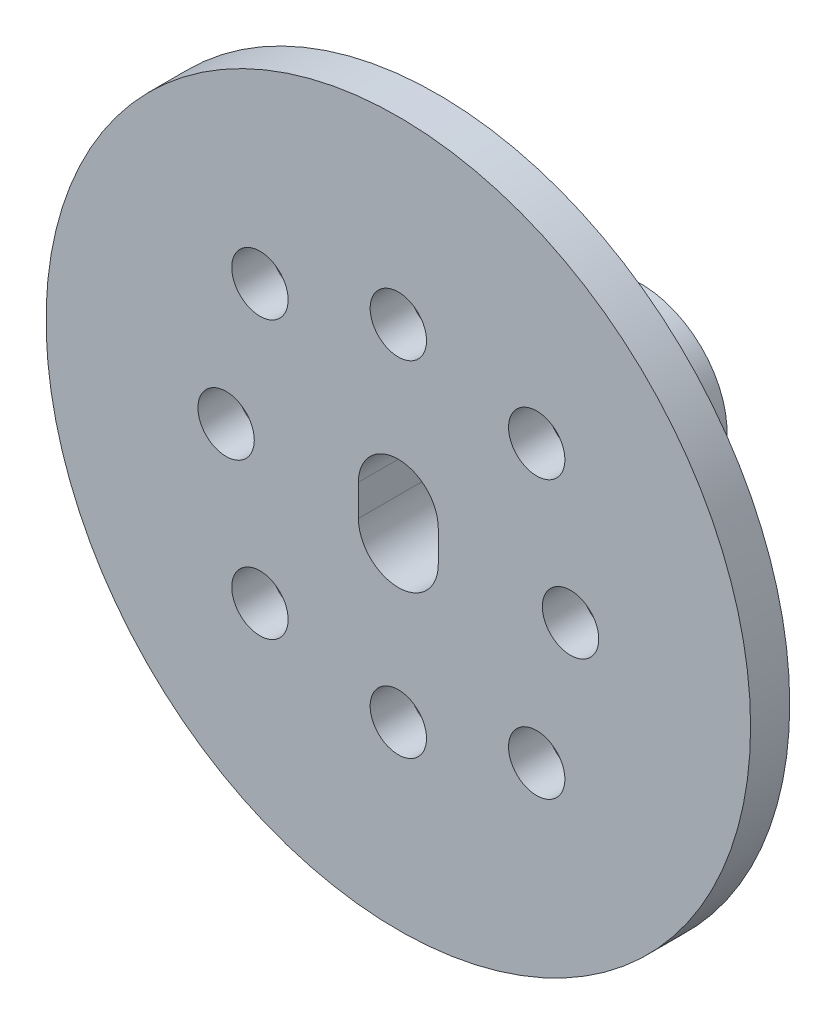
ISO-10303-21;
HEADER;
FILE_DESCRIPTION(('STEP AP214'),'2;1');
FILE_NAME('part.step','',(''),(''),'','','');
FILE_SCHEMA(('AUTOMOTIVE_DESIGN { 1 0 10303 214 1 1 1 1 }'));
ENDSEC;
DATA;
#1=APPLICATION_CONTEXT('core data for automotive mechanical design processes');
#2=APPLICATION_PROTOCOL_DEFINITION('international standard','automotive_design',2000,#1);
#3=PRODUCT_CONTEXT('',#1,'mechanical');
#4=PRODUCT('Part','Part','',(#3));
#5=PRODUCT_RELATED_PRODUCT_CATEGORY('part','',(#4));
#6=PRODUCT_DEFINITION_FORMATION('','',#4);
#7=PRODUCT_DEFINITION_CONTEXT('part definition',#1,'design');
#8=PRODUCT_DEFINITION('design','',#6,#7);
#9=PRODUCT_DEFINITION_SHAPE('','',#8);
#10=(LENGTH_UNIT() NAMED_UNIT(*) SI_UNIT(.MILLI.,.METRE.));
#11=(NAMED_UNIT(*) PLANE_ANGLE_UNIT() SI_UNIT($,.RADIAN.));
#12=(NAMED_UNIT(*) SI_UNIT($,.STERADIAN.) SOLID_ANGLE_UNIT());
#13=UNCERTAINTY_MEASURE_WITH_UNIT(LENGTH_MEASURE(1.E-05),#10,'distance_accuracy_value','');
#14=(GEOMETRIC_REPRESENTATION_CONTEXT(3) GLOBAL_UNCERTAINTY_ASSIGNED_CONTEXT((#13)) GLOBAL_UNIT_ASSIGNED_CONTEXT((#10,
#11,#12)) REPRESENTATION_CONTEXT('',''));
#15=CARTESIAN_POINT('',(0.,0.,0.));
#16=DIRECTION('',(0.,0.,1.));
#17=DIRECTION('',(1.,0.,0.));
#18=AXIS2_PLACEMENT_3D('',#15,#16,#17);
#19=CARTESIAN_POINT('',(0.,0.,-13.));
#20=DIRECTION('',(0.,0.,-1.));
#21=DIRECTION('',(-1.,0.,0.));
#22=AXIS2_PLACEMENT_3D('',#19,#20,#21);
#23=PLANE('',#22);
#24=CARTESIAN_POINT('',(0.000237242195675481,1.0001390942149,-13.));
#25=DIRECTION('',(0.,0.,-1.));
#26=DIRECTION('',(-1.,0.,0.));
#27=AXIS2_PLACEMENT_3D('',#24,#25,#26);
#28=CIRCLE('',#27,3.05);
#29=CARTESIAN_POINT('',(3.05023724219568,1.0001390942149,-13.));
#30=VERTEX_POINT('',#29);
#31=CARTESIAN_POINT('',(-3.04976275780432,1.0001390942149,-13.));
#32=VERTEX_POINT('',#31);
#33=EDGE_CURVE('E187',#30,#32,#28,.F.);
#34=ORIENTED_EDGE('',*,*,#33,.T.);
#35=DIRECTION('',(0.,1.,0.));
#36=VECTOR('',#35,1.);
#37=CARTESIAN_POINT('',(-3.04976275780432,0.,-13.));
#38=LINE('',#37,#36);
#39=CARTESIAN_POINT('',(-3.04976275780432,-0.999860905785103,-13.));
#40=VERTEX_POINT('',#39);
#41=EDGE_CURVE('E191',#32,#40,#38,.F.);
#42=ORIENTED_EDGE('',*,*,#41,.T.);
#43=CARTESIAN_POINT('',(0.000237242195675477,-0.999860905785103,-13.));
#44=DIRECTION('',(0.,0.,-1.));
#45=DIRECTION('',(-1.,0.,0.));
#46=AXIS2_PLACEMENT_3D('',#43,#44,#45);
#47=CIRCLE('',#46,3.05);
#48=CARTESIAN_POINT('',(3.05023724219568,-0.999860905785103,-13.));
#49=VERTEX_POINT('',#48);
#50=EDGE_CURVE('E188',#40,#49,#47,.F.);
#51=ORIENTED_EDGE('',*,*,#50,.T.);
#52=DIRECTION('',(0.,1.,0.));
#53=VECTOR('',#52,1.);
#54=CARTESIAN_POINT('',(3.05023724219568,1.0001390942149,-13.));
#55=LINE('',#54,#53);
#56=EDGE_CURVE('E189',#49,#30,#55,.T.);
#57=ORIENTED_EDGE('',*,*,#56,.T.);
#58=EDGE_LOOP('',(#34,#42,#51,#57));
#59=FACE_BOUND('',#58,.T.);
#60=CARTESIAN_POINT('',(0.,0.,-13.));
#61=DIRECTION('',(0.,0.,-1.));
#62=DIRECTION('',(-1.,0.,0.));
#63=AXIS2_PLACEMENT_3D('',#60,#61,#62);
#64=CIRCLE('',#63,5.5);
#65=CARTESIAN_POINT('',(-5.5,0.,-13.));
#66=VERTEX_POINT('',#65);
#67=EDGE_CURVE('E117',#66,#66,#64,.T.);
#68=ORIENTED_EDGE('',*,*,#67,.T.);
#69=EDGE_LOOP('',(#68));
#70=FACE_BOUND('',#69,.T.);
#71=ADVANCED_FACE('F43',(#59,#70),#23,.T.);
#72=CARTESIAN_POINT('',(0.,0.,2.5));
#73=DIRECTION('',(0.,0.,-1.));
#74=DIRECTION('',(-1.,0.,0.));
#75=AXIS2_PLACEMENT_3D('',#72,#73,#74);
#76=CYLINDRICAL_SURFACE('',#75,22.5);
#77=CARTESIAN_POINT('',(0.,0.,2.5));
#78=DIRECTION('',(0.,0.,1.));
#79=DIRECTION('',(1.,0.,0.));
#80=AXIS2_PLACEMENT_3D('',#77,#78,#79);
#81=CIRCLE('',#80,22.5);
#82=CARTESIAN_POINT('',(22.5,0.,2.5));
#83=VERTEX_POINT('',#82);
#84=EDGE_CURVE('E156',#83,#83,#81,.T.);
#85=ORIENTED_EDGE('',*,*,#84,.F.);
#86=EDGE_LOOP('',(#85));
#87=FACE_BOUND('',#86,.T.);
#88=CARTESIAN_POINT('',(0.,0.,0.));
#89=DIRECTION('',(0.,0.,1.));
#90=DIRECTION('',(1.,0.,0.));
#91=AXIS2_PLACEMENT_3D('',#88,#89,#90);
#92=CIRCLE('',#91,22.5);
#93=CARTESIAN_POINT('',(22.5,0.,0.));
#94=VERTEX_POINT('',#93);
#95=EDGE_CURVE('E154',#94,#94,#92,.T.);
#96=ORIENTED_EDGE('',*,*,#95,.T.);
#97=EDGE_LOOP('',(#96));
#98=FACE_BOUND('',#97,.T.);
#99=ADVANCED_FACE('F239',(#87,#98),#76,.T.);
#100=CARTESIAN_POINT('',(0.,0.,2.5));
#101=DIRECTION('',(0.,0.,1.));
#102=DIRECTION('',(1.,0.,0.));
#103=AXIS2_PLACEMENT_3D('',#100,#101,#102);
#104=PLANE('',#103);
#105=CARTESIAN_POINT('',(0.000237242195675481,1.0001390942149,2.5));
#106=DIRECTION('',(0.,0.,-1.));
#107=DIRECTION('',(-1.,0.,0.));
#108=AXIS2_PLACEMENT_3D('',#105,#106,#107);
#109=CIRCLE('',#108,2.55);
#110=CARTESIAN_POINT('',(-2.54976275780432,1.0001390942149,2.5));
#111=VERTEX_POINT('',#110);
#112=CARTESIAN_POINT('',(2.55023724219568,1.0001390942149,2.5));
#113=VERTEX_POINT('',#112);
#114=EDGE_CURVE('E100',#111,#113,#109,.T.);
#115=ORIENTED_EDGE('',*,*,#114,.T.);
#116=DIRECTION('',(0.,-1.,0.));
#117=VECTOR('',#116,1.);
#118=CARTESIAN_POINT('',(2.55023724219568,1.0001390942149,2.5));
#119=LINE('',#118,#117);
#120=CARTESIAN_POINT('',(2.55023724219568,-0.999860905785103,2.5));
#121=VERTEX_POINT('',#120);
#122=EDGE_CURVE('E102',#113,#121,#119,.T.);
#123=ORIENTED_EDGE('',*,*,#122,.T.);
#124=CARTESIAN_POINT('',(0.000237242195675477,-0.999860905785103,2.5));
#125=DIRECTION('',(0.,0.,-1.));
#126=DIRECTION('',(-1.,0.,0.));
#127=AXIS2_PLACEMENT_3D('',#124,#125,#126);
#128=CIRCLE('',#127,2.55);
#129=CARTESIAN_POINT('',(-2.54976275780432,-0.999860905785103,2.5));
#130=VERTEX_POINT('',#129);
#131=EDGE_CURVE('E107',#121,#130,#128,.T.);
#132=ORIENTED_EDGE('',*,*,#131,.T.);
#133=DIRECTION('',(0.,1.,0.));
#134=VECTOR('',#133,1.);
#135=CARTESIAN_POINT('',(-2.54976275780432,-0.999860905785103,2.5));
#136=LINE('',#135,#134);
#137=EDGE_CURVE('E112',#130,#111,#136,.T.);
#138=ORIENTED_EDGE('',*,*,#137,.T.);
#139=EDGE_LOOP('',(#115,#123,#132,#138));
#140=FACE_BOUND('',#139,.T.);
#141=CARTESIAN_POINT('',(-8.83883476483183,8.83883476483186,2.5));
#142=DIRECTION('',(0.,0.,1.));
#143=DIRECTION('',(1.,0.,0.));
#144=AXIS2_PLACEMENT_3D('',#141,#142,#143);
#145=CIRCLE('',#144,1.8);
#146=CARTESIAN_POINT('',(-7.03883476483183,8.83883476483186,2.5));
#147=VERTEX_POINT('',#146);
#148=EDGE_CURVE('E134',#147,#147,#145,.T.);
#149=ORIENTED_EDGE('',*,*,#148,.F.);
#150=EDGE_LOOP('',(#149));
#151=FACE_BOUND('',#150,.T.);
#152=CARTESIAN_POINT('',(8.83883476483189,8.8388347648318,2.5));
#153=DIRECTION('',(0.,0.,1.));
#154=DIRECTION('',(1.,0.,0.));
#155=AXIS2_PLACEMENT_3D('',#152,#153,#154);
#156=CIRCLE('',#155,1.8);
#157=CARTESIAN_POINT('',(10.6388347648319,8.8388347648318,2.5));
#158=VERTEX_POINT('',#157);
#159=EDGE_CURVE('E138',#158,#158,#156,.T.);
#160=ORIENTED_EDGE('',*,*,#159,.F.);
#161=EDGE_LOOP('',(#160));
#162=FACE_BOUND('',#161,.T.);
#163=CARTESIAN_POINT('',(8.83883476483177,-8.83883476483192,2.5));
#164=DIRECTION('',(0.,0.,1.));
#165=DIRECTION('',(1.,0.,0.));
#166=AXIS2_PLACEMENT_3D('',#163,#164,#165);
#167=CIRCLE('',#166,1.8);
#168=CARTESIAN_POINT('',(10.6388347648318,-8.83883476483192,2.5));
#169=VERTEX_POINT('',#168);
#170=EDGE_CURVE('E145',#169,#169,#167,.T.);
#171=ORIENTED_EDGE('',*,*,#170,.F.);
#172=EDGE_LOOP('',(#171));
#173=FACE_BOUND('',#172,.T.);
#174=CARTESIAN_POINT('',(-8.83883476483195,-8.83883476483174,2.5));
#175=DIRECTION('',(0.,0.,1.));
#176=DIRECTION('',(1.,0.,0.));
#177=AXIS2_PLACEMENT_3D('',#174,#175,#176);
#178=CIRCLE('',#177,1.8);
#179=CARTESIAN_POINT('',(-7.03883476483195,-8.83883476483174,2.5));
#180=VERTEX_POINT('',#179);
#181=EDGE_CURVE('E130',#180,#180,#178,.T.);
#182=ORIENTED_EDGE('',*,*,#181,.F.);
#183=EDGE_LOOP('',(#182));
#184=FACE_BOUND('',#183,.T.);
#185=CARTESIAN_POINT('',(11.,0.,2.5));
#186=DIRECTION('',(0.,0.,1.));
#187=DIRECTION('',(1.,0.,0.));
#188=AXIS2_PLACEMENT_3D('',#185,#186,#187);
#189=CIRCLE('',#188,1.8);
#190=CARTESIAN_POINT('',(12.8,0.,2.5));
#191=VERTEX_POINT('',#190);
#192=EDGE_CURVE('E123',#191,#191,#189,.T.);
#193=ORIENTED_EDGE('',*,*,#192,.F.);
#194=EDGE_LOOP('',(#193));
#195=FACE_BOUND('',#194,.T.);
#196=CARTESIAN_POINT('',(0.,-11.,2.5));
#197=DIRECTION('',(0.,0.,1.));
#198=DIRECTION('',(1.,0.,0.));
#199=AXIS2_PLACEMENT_3D('',#196,#197,#198);
#200=CIRCLE('',#199,1.8);
#201=CARTESIAN_POINT('',(1.79999999999992,-11.,2.5));
#202=VERTEX_POINT('',#201);
#203=EDGE_CURVE('E128',#202,#202,#200,.T.);
#204=ORIENTED_EDGE('',*,*,#203,.F.);
#205=EDGE_LOOP('',(#204));
#206=FACE_BOUND('',#205,.T.);
#207=CARTESIAN_POINT('',(-11.,1.15218884181823E-13,2.5));
#208=DIRECTION('',(0.,0.,1.));
#209=DIRECTION('',(1.,0.,0.));
#210=AXIS2_PLACEMENT_3D('',#207,#208,#209);
#211=CIRCLE('',#210,1.8);
#212=CARTESIAN_POINT('',(-9.2,1.15218884181823E-13,2.5));
#213=VERTEX_POINT('',#212);
#214=EDGE_CURVE('E135',#213,#213,#211,.T.);
#215=ORIENTED_EDGE('',*,*,#214,.F.);
#216=EDGE_LOOP('',(#215));
#217=FACE_BOUND('',#216,.T.);
#218=CARTESIAN_POINT('',(0.,11.,2.5));
#219=DIRECTION('',(0.,0.,1.));
#220=DIRECTION('',(1.,0.,0.));
#221=AXIS2_PLACEMENT_3D('',#218,#219,#220);
#222=CIRCLE('',#221,1.8);
#223=CARTESIAN_POINT('',(1.8,11.,2.5));
#224=VERTEX_POINT('',#223);
#225=EDGE_CURVE('E139',#224,#224,#222,.T.);
#226=ORIENTED_EDGE('',*,*,#225,.F.);
#227=EDGE_LOOP('',(#226));
#228=FACE_BOUND('',#227,.T.);
#229=ORIENTED_EDGE('',*,*,#84,.T.);
#230=EDGE_LOOP('',(#229));
#231=FACE_BOUND('',#230,.T.);
#232=ADVANCED_FACE('F111',(#140,#151,#162,#173,#184,#195,#206,#217,#228,#231),#104,.T.);
#233=CARTESIAN_POINT('',(0.,0.,0.));
#234=DIRECTION('',(0.,0.,1.));
#235=DIRECTION('',(1.,0.,0.));
#236=AXIS2_PLACEMENT_3D('',#233,#234,#235);
#237=PLANE('',#236);
#238=CARTESIAN_POINT('',(-8.83883476483183,8.83883476483186,0.));
#239=DIRECTION('',(0.,0.,1.));
#240=DIRECTION('',(1.,0.,0.));
#241=AXIS2_PLACEMENT_3D('',#238,#239,#240);
#242=CIRCLE('',#241,1.8);
#243=CARTESIAN_POINT('',(-7.03883476483183,8.83883476483186,0.));
#244=VERTEX_POINT('',#243);
#245=EDGE_CURVE('E155',#244,#244,#242,.T.);
#246=ORIENTED_EDGE('',*,*,#245,.T.);
#247=EDGE_LOOP('',(#246));
#248=FACE_BOUND('',#247,.T.);
#249=CARTESIAN_POINT('',(8.83883476483189,8.8388347648318,0.));
#250=DIRECTION('',(0.,0.,1.));
#251=DIRECTION('',(1.,0.,0.));
#252=AXIS2_PLACEMENT_3D('',#249,#250,#251);
#253=CIRCLE('',#252,1.8);
#254=CARTESIAN_POINT('',(10.6388347648319,8.8388347648318,0.));
#255=VERTEX_POINT('',#254);
#256=EDGE_CURVE('E177',#255,#255,#253,.T.);
#257=ORIENTED_EDGE('',*,*,#256,.T.);
#258=EDGE_LOOP('',(#257));
#259=FACE_BOUND('',#258,.T.);
#260=CARTESIAN_POINT('',(8.83883476483177,-8.83883476483192,0.));
#261=DIRECTION('',(0.,0.,1.));
#262=DIRECTION('',(1.,0.,0.));
#263=AXIS2_PLACEMENT_3D('',#260,#261,#262);
#264=CIRCLE('',#263,1.8);
#265=CARTESIAN_POINT('',(10.6388347648318,-8.83883476483192,0.));
#266=VERTEX_POINT('',#265);
#267=EDGE_CURVE('E176',#266,#266,#264,.T.);
#268=ORIENTED_EDGE('',*,*,#267,.T.);
#269=EDGE_LOOP('',(#268));
#270=FACE_BOUND('',#269,.T.);
#271=CARTESIAN_POINT('',(-8.83883476483195,-8.83883476483174,0.));
#272=DIRECTION('',(0.,0.,1.));
#273=DIRECTION('',(1.,0.,0.));
#274=AXIS2_PLACEMENT_3D('',#271,#272,#273);
#275=CIRCLE('',#274,1.8);
#276=CARTESIAN_POINT('',(-7.03883476483195,-8.83883476483174,0.));
#277=VERTEX_POINT('',#276);
#278=EDGE_CURVE('E173',#277,#277,#275,.T.);
#279=ORIENTED_EDGE('',*,*,#278,.T.);
#280=EDGE_LOOP('',(#279));
#281=FACE_BOUND('',#280,.T.);
#282=CARTESIAN_POINT('',(11.,0.,0.));
#283=DIRECTION('',(0.,0.,1.));
#284=DIRECTION('',(1.,0.,0.));
#285=AXIS2_PLACEMENT_3D('',#282,#283,#284);
#286=CIRCLE('',#285,1.8);
#287=CARTESIAN_POINT('',(12.8,0.,0.));
#288=VERTEX_POINT('',#287);
#289=EDGE_CURVE('E167',#288,#288,#286,.T.);
#290=ORIENTED_EDGE('',*,*,#289,.T.);
#291=EDGE_LOOP('',(#290));
#292=FACE_BOUND('',#291,.T.);
#293=CARTESIAN_POINT('',(0.,-11.,0.));
#294=DIRECTION('',(0.,0.,1.));
#295=DIRECTION('',(1.,0.,0.));
#296=AXIS2_PLACEMENT_3D('',#293,#294,#295);
#297=CIRCLE('',#296,1.8);
#298=CARTESIAN_POINT('',(1.79999999999992,-11.,0.));
#299=VERTEX_POINT('',#298);
#300=EDGE_CURVE('E170',#299,#299,#297,.T.);
#301=ORIENTED_EDGE('',*,*,#300,.T.);
#302=EDGE_LOOP('',(#301));
#303=FACE_BOUND('',#302,.T.);
#304=CARTESIAN_POINT('',(-11.,1.15218884181823E-13,0.));
#305=DIRECTION('',(0.,0.,1.));
#306=DIRECTION('',(1.,0.,0.));
#307=AXIS2_PLACEMENT_3D('',#304,#305,#306);
#308=CIRCLE('',#307,1.8);
#309=CARTESIAN_POINT('',(-9.2,1.15218884181823E-13,0.));
#310=VERTEX_POINT('',#309);
#311=EDGE_CURVE('E165',#310,#310,#308,.T.);
#312=ORIENTED_EDGE('',*,*,#311,.T.);
#313=EDGE_LOOP('',(#312));
#314=FACE_BOUND('',#313,.T.);
#315=CARTESIAN_POINT('',(0.,11.,0.));
#316=DIRECTION('',(0.,0.,1.));
#317=DIRECTION('',(1.,0.,0.));
#318=AXIS2_PLACEMENT_3D('',#315,#316,#317);
#319=CIRCLE('',#318,1.8);
#320=CARTESIAN_POINT('',(1.8,11.,0.));
#321=VERTEX_POINT('',#320);
#322=EDGE_CURVE('E148',#321,#321,#319,.T.);
#323=ORIENTED_EDGE('',*,*,#322,.T.);
#324=EDGE_LOOP('',(#323));
#325=FACE_BOUND('',#324,.T.);
#326=ORIENTED_EDGE('',*,*,#95,.F.);
#327=EDGE_LOOP('',(#326));
#328=FACE_BOUND('',#327,.T.);
#329=CARTESIAN_POINT('',(0.,0.,0.));
#330=DIRECTION('',(0.,0.,-1.));
#331=DIRECTION('',(-1.,0.,0.));
#332=AXIS2_PLACEMENT_3D('',#329,#330,#331);
#333=CIRCLE('',#332,5.5);
#334=CARTESIAN_POINT('',(-5.5,0.,0.));
#335=VERTEX_POINT('',#334);
#336=EDGE_CURVE('E114',#335,#335,#333,.T.);
#337=ORIENTED_EDGE('',*,*,#336,.F.);
#338=EDGE_LOOP('',(#337));
#339=FACE_BOUND('',#338,.T.);
#340=ADVANCED_FACE('F226',(#248,#259,#270,#281,#292,#303,#314,#325,#328,#339),#237,.F.);
#341=CARTESIAN_POINT('',(0.000237242195675477,-0.999860905785103,-13.));
#342=DIRECTION('',(0.,0.,1.));
#343=DIRECTION('',(1.,0.,0.));
#344=AXIS2_PLACEMENT_3D('',#341,#342,#343);
#345=CYLINDRICAL_SURFACE('',#344,2.55);
#346=DIRECTION('',(0.,0.,1.));
#347=VECTOR('',#346,1.);
#348=CARTESIAN_POINT('',(2.55023724219568,-0.999860905785103,-13.));
#349=LINE('',#348,#347);
#350=CARTESIAN_POINT('',(2.55023724219568,-0.999860905785103,-12.5));
#351=VERTEX_POINT('',#350);
#352=EDGE_CURVE('E58',#351,#121,#349,.T.);
#353=ORIENTED_EDGE('',*,*,#352,.F.);
#354=CARTESIAN_POINT('',(0.000237242195675477,-0.999860905785103,-12.5));
#355=DIRECTION('',(0.,0.,-1.));
#356=DIRECTION('',(-1.,0.,0.));
#357=AXIS2_PLACEMENT_3D('',#354,#355,#356);
#358=CIRCLE('',#357,2.55);
#359=CARTESIAN_POINT('',(-2.54976275780432,-0.999860905785103,-12.5));
#360=VERTEX_POINT('',#359);
#361=EDGE_CURVE('E192',#351,#360,#358,.T.);
#362=ORIENTED_EDGE('',*,*,#361,.T.);
#363=DIRECTION('',(0.,0.,1.));
#364=VECTOR('',#363,1.);
#365=CARTESIAN_POINT('',(-2.54976275780432,-0.999860905785103,-13.));
#366=LINE('',#365,#364);
#367=EDGE_CURVE('E147',#360,#130,#366,.T.);
#368=ORIENTED_EDGE('',*,*,#367,.T.);
#369=ORIENTED_EDGE('',*,*,#131,.F.);
#370=EDGE_LOOP('',(#353,#362,#368,#369));
#371=FACE_BOUND('',#370,.T.);
#372=ADVANCED_FACE('F228',(#371),#345,.F.);
#373=CARTESIAN_POINT('',(2.55023724219568,0.,-13.));
#374=DIRECTION('',(1.,0.,0.));
#375=DIRECTION('',(0.,0.,-1.));
#376=AXIS2_PLACEMENT_3D('',#373,#374,#375);
#377=PLANE('',#376);
#378=DIRECTION('',(0.,0.,1.));
#379=VECTOR('',#378,1.);
#380=CARTESIAN_POINT('',(2.55023724219568,1.0001390942149,-13.));
#381=LINE('',#380,#379);
#382=CARTESIAN_POINT('',(2.55023724219568,1.0001390942149,-12.5));
#383=VERTEX_POINT('',#382);
#384=EDGE_CURVE('E98',#383,#113,#381,.T.);
#385=ORIENTED_EDGE('',*,*,#384,.F.);
#386=DIRECTION('',(0.,1.,0.));
#387=VECTOR('',#386,1.);
#388=CARTESIAN_POINT('',(2.55023724219568,-0.999860905785103,-12.5));
#389=LINE('',#388,#387);
#390=EDGE_CURVE('E55',#383,#351,#389,.F.);
#391=ORIENTED_EDGE('',*,*,#390,.T.);
#392=ORIENTED_EDGE('',*,*,#352,.T.);
#393=ORIENTED_EDGE('',*,*,#122,.F.);
#394=EDGE_LOOP('',(#385,#391,#392,#393));
#395=FACE_BOUND('',#394,.T.);
#396=ADVANCED_FACE('F106',(#395),#377,.F.);
#397=CARTESIAN_POINT('',(0.000237242195675481,1.0001390942149,-13.));
#398=DIRECTION('',(0.,0.,1.));
#399=DIRECTION('',(1.,0.,0.));
#400=AXIS2_PLACEMENT_3D('',#397,#398,#399);
#401=CYLINDRICAL_SURFACE('',#400,2.55);
#402=DIRECTION('',(0.,0.,1.));
#403=VECTOR('',#402,1.);
#404=CARTESIAN_POINT('',(-2.54976275780432,1.0001390942149,-13.));
#405=LINE('',#404,#403);
#406=CARTESIAN_POINT('',(-2.54976275780432,1.0001390942149,-12.5));
#407=VERTEX_POINT('',#406);
#408=EDGE_CURVE('E105',#407,#111,#405,.T.);
#409=ORIENTED_EDGE('',*,*,#408,.F.);
#410=CARTESIAN_POINT('',(0.000237242195675481,1.0001390942149,-12.5));
#411=DIRECTION('',(0.,0.,-1.));
#412=DIRECTION('',(-1.,0.,0.));
#413=AXIS2_PLACEMENT_3D('',#410,#411,#412);
#414=CIRCLE('',#413,2.55);
#415=EDGE_CURVE('E11',#407,#383,#414,.T.);
#416=ORIENTED_EDGE('',*,*,#415,.T.);
#417=ORIENTED_EDGE('',*,*,#384,.T.);
#418=ORIENTED_EDGE('',*,*,#114,.F.);
#419=EDGE_LOOP('',(#409,#416,#417,#418));
#420=FACE_BOUND('',#419,.T.);
#421=ADVANCED_FACE('F97',(#420),#401,.F.);
#422=CARTESIAN_POINT('',(-2.54976275780432,0.,-13.));
#423=DIRECTION('',(1.,0.,0.));
#424=DIRECTION('',(0.,0.,-1.));
#425=AXIS2_PLACEMENT_3D('',#422,#423,#424);
#426=PLANE('',#425);
#427=ORIENTED_EDGE('',*,*,#367,.F.);
#428=DIRECTION('',(0.,1.,0.));
#429=VECTOR('',#428,1.);
#430=CARTESIAN_POINT('',(-2.54976275780432,0.,-12.5));
#431=LINE('',#430,#429);
#432=EDGE_CURVE('E158',#360,#407,#431,.T.);
#433=ORIENTED_EDGE('',*,*,#432,.T.);
#434=ORIENTED_EDGE('',*,*,#408,.T.);
#435=ORIENTED_EDGE('',*,*,#137,.F.);
#436=EDGE_LOOP('',(#427,#433,#434,#435));
#437=FACE_BOUND('',#436,.T.);
#438=ADVANCED_FACE('F223',(#437),#426,.T.);
#439=CARTESIAN_POINT('',(0.,11.,-3.5));
#440=DIRECTION('',(0.,0.,1.));
#441=DIRECTION('',(1.,0.,0.));
#442=AXIS2_PLACEMENT_3D('',#439,#440,#441);
#443=CYLINDRICAL_SURFACE('',#442,1.8);
#444=ORIENTED_EDGE('',*,*,#225,.T.);
#445=EDGE_LOOP('',(#444));
#446=FACE_BOUND('',#445,.T.);
#447=ORIENTED_EDGE('',*,*,#322,.F.);
#448=EDGE_LOOP('',(#447));
#449=FACE_BOUND('',#448,.T.);
#450=ADVANCED_FACE('F249',(#446,#449),#443,.F.);
#451=CARTESIAN_POINT('',(-11.,1.15218884181823E-13,-3.5));
#452=DIRECTION('',(0.,0.,1.));
#453=DIRECTION('',(1.,0.,0.));
#454=AXIS2_PLACEMENT_3D('',#451,#452,#453);
#455=CYLINDRICAL_SURFACE('',#454,1.8);
#456=ORIENTED_EDGE('',*,*,#214,.T.);
#457=EDGE_LOOP('',(#456));
#458=FACE_BOUND('',#457,.T.);
#459=ORIENTED_EDGE('',*,*,#311,.F.);
#460=EDGE_LOOP('',(#459));
#461=FACE_BOUND('',#460,.T.);
#462=ADVANCED_FACE('F312',(#458,#461),#455,.F.);
#463=CARTESIAN_POINT('',(0.,-11.,-3.5));
#464=DIRECTION('',(0.,0.,1.));
#465=DIRECTION('',(1.,0.,0.));
#466=AXIS2_PLACEMENT_3D('',#463,#464,#465);
#467=CYLINDRICAL_SURFACE('',#466,1.8);
#468=ORIENTED_EDGE('',*,*,#203,.T.);
#469=EDGE_LOOP('',(#468));
#470=FACE_BOUND('',#469,.T.);
#471=ORIENTED_EDGE('',*,*,#300,.F.);
#472=EDGE_LOOP('',(#471));
#473=FACE_BOUND('',#472,.T.);
#474=ADVANCED_FACE('F307',(#470,#473),#467,.F.);
#475=CARTESIAN_POINT('',(11.,0.,-3.5));
#476=DIRECTION('',(0.,0.,1.));
#477=DIRECTION('',(1.,0.,0.));
#478=AXIS2_PLACEMENT_3D('',#475,#476,#477);
#479=CYLINDRICAL_SURFACE('',#478,1.8);
#480=ORIENTED_EDGE('',*,*,#192,.T.);
#481=EDGE_LOOP('',(#480));
#482=FACE_BOUND('',#481,.T.);
#483=ORIENTED_EDGE('',*,*,#289,.F.);
#484=EDGE_LOOP('',(#483));
#485=FACE_BOUND('',#484,.T.);
#486=ADVANCED_FACE('F304',(#482,#485),#479,.F.);
#487=CARTESIAN_POINT('',(-8.83883476483195,-8.83883476483174,-3.5));
#488=DIRECTION('',(0.,0.,1.));
#489=DIRECTION('',(1.,0.,0.));
#490=AXIS2_PLACEMENT_3D('',#487,#488,#489);
#491=CYLINDRICAL_SURFACE('',#490,1.8);
#492=ORIENTED_EDGE('',*,*,#181,.T.);
#493=EDGE_LOOP('',(#492));
#494=FACE_BOUND('',#493,.T.);
#495=ORIENTED_EDGE('',*,*,#278,.F.);
#496=EDGE_LOOP('',(#495));
#497=FACE_BOUND('',#496,.T.);
#498=ADVANCED_FACE('F308',(#494,#497),#491,.F.);
#499=CARTESIAN_POINT('',(8.83883476483177,-8.83883476483192,-3.5));
#500=DIRECTION('',(0.,0.,1.));
#501=DIRECTION('',(1.,0.,0.));
#502=AXIS2_PLACEMENT_3D('',#499,#500,#501);
#503=CYLINDRICAL_SURFACE('',#502,1.8);
#504=ORIENTED_EDGE('',*,*,#170,.T.);
#505=EDGE_LOOP('',(#504));
#506=FACE_BOUND('',#505,.T.);
#507=ORIENTED_EDGE('',*,*,#267,.F.);
#508=EDGE_LOOP('',(#507));
#509=FACE_BOUND('',#508,.T.);
#510=ADVANCED_FACE('F322',(#506,#509),#503,.F.);
#511=CARTESIAN_POINT('',(8.83883476483189,8.8388347648318,-3.5));
#512=DIRECTION('',(0.,0.,1.));
#513=DIRECTION('',(1.,0.,0.));
#514=AXIS2_PLACEMENT_3D('',#511,#512,#513);
#515=CYLINDRICAL_SURFACE('',#514,1.8);
#516=ORIENTED_EDGE('',*,*,#159,.T.);
#517=EDGE_LOOP('',(#516));
#518=FACE_BOUND('',#517,.T.);
#519=ORIENTED_EDGE('',*,*,#256,.F.);
#520=EDGE_LOOP('',(#519));
#521=FACE_BOUND('',#520,.T.);
#522=ADVANCED_FACE('F324',(#518,#521),#515,.F.);
#523=CARTESIAN_POINT('',(-8.83883476483183,8.83883476483186,-3.5));
#524=DIRECTION('',(0.,0.,1.));
#525=DIRECTION('',(1.,0.,0.));
#526=AXIS2_PLACEMENT_3D('',#523,#524,#525);
#527=CYLINDRICAL_SURFACE('',#526,1.8);
#528=ORIENTED_EDGE('',*,*,#148,.T.);
#529=EDGE_LOOP('',(#528));
#530=FACE_BOUND('',#529,.T.);
#531=ORIENTED_EDGE('',*,*,#245,.F.);
#532=EDGE_LOOP('',(#531));
#533=FACE_BOUND('',#532,.T.);
#534=ADVANCED_FACE('F319',(#530,#533),#527,.F.);
#535=CARTESIAN_POINT('',(3.05023724219568,0.,-12.5));
#536=DIRECTION('',(0.,-1.,0.));
#537=DIRECTION('',(0.,0.,-1.));
#538=AXIS2_PLACEMENT_3D('',#535,#536,#537);
#539=CYLINDRICAL_SURFACE('',#538,0.5);
#540=CARTESIAN_POINT('',(3.05023724219568,1.0001390942149,-12.5));
#541=DIRECTION('',(0.,1.,0.));
#542=DIRECTION('',(0.,0.,1.));
#543=AXIS2_PLACEMENT_3D('',#540,#541,#542);
#544=CIRCLE('',#543,0.5);
#545=EDGE_CURVE('E199',#30,#383,#544,.T.);
#546=ORIENTED_EDGE('',*,*,#545,.F.);
#547=ORIENTED_EDGE('',*,*,#56,.F.);
#548=CARTESIAN_POINT('',(3.05023724219568,-0.999860905785103,-12.5));
#549=DIRECTION('',(0.,-1.,0.));
#550=DIRECTION('',(0.,0.,-1.));
#551=AXIS2_PLACEMENT_3D('',#548,#549,#550);
#552=CIRCLE('',#551,0.5);
#553=EDGE_CURVE('E50',#351,#49,#552,.T.);
#554=ORIENTED_EDGE('',*,*,#553,.F.);
#555=ORIENTED_EDGE('',*,*,#390,.F.);
#556=EDGE_LOOP('',(#546,#547,#554,#555));
#557=FACE_BOUND('',#556,.T.);
#558=ADVANCED_FACE('F44',(#557),#539,.T.);
#559=CARTESIAN_POINT('',(0.000237242195675477,-0.999860905785103,-12.5));
#560=DIRECTION('',(0.,0.,-1.));
#561=DIRECTION('',(-1.,0.,0.));
#562=AXIS2_PLACEMENT_3D('',#559,#560,#561);
#563=TOROIDAL_SURFACE('',#562,3.05,0.5);
#564=ORIENTED_EDGE('',*,*,#553,.T.);
#565=ORIENTED_EDGE('',*,*,#50,.F.);
#566=CARTESIAN_POINT('',(-3.04976275780432,-0.999860905785103,-12.5));
#567=DIRECTION('',(0.,1.,0.));
#568=DIRECTION('',(0.,0.,1.));
#569=AXIS2_PLACEMENT_3D('',#566,#567,#568);
#570=CIRCLE('',#569,0.5);
#571=EDGE_CURVE('E197',#360,#40,#570,.T.);
#572=ORIENTED_EDGE('',*,*,#571,.F.);
#573=ORIENTED_EDGE('',*,*,#361,.F.);
#574=EDGE_LOOP('',(#564,#565,#572,#573));
#575=FACE_BOUND('',#574,.T.);
#576=ADVANCED_FACE('F208',(#575),#563,.T.);
#577=CARTESIAN_POINT('',(0.000237242195675481,1.0001390942149,-12.5));
#578=DIRECTION('',(0.,0.,-1.));
#579=DIRECTION('',(-1.,0.,0.));
#580=AXIS2_PLACEMENT_3D('',#577,#578,#579);
#581=TOROIDAL_SURFACE('',#580,3.05,0.5);
#582=ORIENTED_EDGE('',*,*,#545,.T.);
#583=ORIENTED_EDGE('',*,*,#415,.F.);
#584=CARTESIAN_POINT('',(-3.04976275780432,1.0001390942149,-12.5));
#585=DIRECTION('',(0.,-1.,0.));
#586=DIRECTION('',(0.,0.,-1.));
#587=AXIS2_PLACEMENT_3D('',#584,#585,#586);
#588=CIRCLE('',#587,0.5);
#589=EDGE_CURVE('E121',#32,#407,#588,.T.);
#590=ORIENTED_EDGE('',*,*,#589,.F.);
#591=ORIENTED_EDGE('',*,*,#33,.F.);
#592=EDGE_LOOP('',(#582,#583,#590,#591));
#593=FACE_BOUND('',#592,.T.);
#594=ADVANCED_FACE('F221',(#593),#581,.T.);
#595=CARTESIAN_POINT('',(-3.04976275780432,0.,-12.5));
#596=DIRECTION('',(0.,1.,0.));
#597=DIRECTION('',(0.,0.,1.));
#598=AXIS2_PLACEMENT_3D('',#595,#596,#597);
#599=CYLINDRICAL_SURFACE('',#598,0.5);
#600=ORIENTED_EDGE('',*,*,#571,.T.);
#601=ORIENTED_EDGE('',*,*,#41,.F.);
#602=ORIENTED_EDGE('',*,*,#589,.T.);
#603=ORIENTED_EDGE('',*,*,#432,.F.);
#604=EDGE_LOOP('',(#600,#601,#602,#603));
#605=FACE_BOUND('',#604,.T.);
#606=ADVANCED_FACE('F217',(#605),#599,.T.);
#607=CARTESIAN_POINT('',(0.,0.,0.));
#608=DIRECTION('',(0.,0.,-1.));
#609=DIRECTION('',(-1.,0.,0.));
#610=AXIS2_PLACEMENT_3D('',#607,#608,#609);
#611=CYLINDRICAL_SURFACE('',#610,5.5);
#612=CARTESIAN_POINT('',(-5.5,0.,0.));
#613=CARTESIAN_POINT('',(-5.5,0.,-0.135416666666666));
#614=CARTESIAN_POINT('',(-5.5,0.,-0.270833333333333));
#615=CARTESIAN_POINT('',(-5.5,0.,-0.541666666666667));
#616=CARTESIAN_POINT('',(-5.5,0.,-0.677083333333333));
#617=CARTESIAN_POINT('',(-5.5,0.,-0.947916666666667));
#618=CARTESIAN_POINT('',(-5.5,0.,-1.08333333333333));
#619=CARTESIAN_POINT('',(-5.5,0.,-1.35416666666667));
#620=CARTESIAN_POINT('',(-5.5,0.,-1.48958333333333));
#621=CARTESIAN_POINT('',(-5.5,0.,-1.76041666666667));
#622=CARTESIAN_POINT('',(-5.5,0.,-1.89583333333333));
#623=CARTESIAN_POINT('',(-5.5,0.,-2.16666666666667));
#624=CARTESIAN_POINT('',(-5.5,0.,-2.30208333333333));
#625=CARTESIAN_POINT('',(-5.5,0.,-2.57291666666667));
#626=CARTESIAN_POINT('',(-5.5,0.,-2.70833333333333));
#627=CARTESIAN_POINT('',(-5.5,0.,-2.97916666666667));
#628=CARTESIAN_POINT('',(-5.5,0.,-3.11458333333333));
#629=CARTESIAN_POINT('',(-5.5,0.,-3.38541666666667));
#630=CARTESIAN_POINT('',(-5.5,0.,-3.52083333333333));
#631=CARTESIAN_POINT('',(-5.5,0.,-3.79166666666667));
#632=CARTESIAN_POINT('',(-5.5,0.,-3.92708333333333));
#633=CARTESIAN_POINT('',(-5.5,0.,-4.19791666666667));
#634=CARTESIAN_POINT('',(-5.5,0.,-4.33333333333333));
#635=CARTESIAN_POINT('',(-5.5,0.,-4.60416666666667));
#636=CARTESIAN_POINT('',(-5.5,0.,-4.73958333333333));
#637=CARTESIAN_POINT('',(-5.5,0.,-5.01041666666667));
#638=CARTESIAN_POINT('',(-5.5,0.,-5.14583333333333));
#639=CARTESIAN_POINT('',(-5.5,0.,-5.41666666666667));
#640=CARTESIAN_POINT('',(-5.5,0.,-5.55208333333333));
#641=CARTESIAN_POINT('',(-5.5,0.,-5.82291666666667));
#642=CARTESIAN_POINT('',(-5.5,0.,-5.95833333333333));
#643=CARTESIAN_POINT('',(-5.5,0.,-6.22916666666667));
#644=CARTESIAN_POINT('',(-5.5,0.,-6.36458333333333));
#645=CARTESIAN_POINT('',(-5.5,0.,-6.63541666666667));
#646=CARTESIAN_POINT('',(-5.5,0.,-6.77083333333333));
#647=CARTESIAN_POINT('',(-5.5,0.,-7.04166666666667));
#648=CARTESIAN_POINT('',(-5.5,0.,-7.17708333333333));
#649=CARTESIAN_POINT('',(-5.5,0.,-7.44791666666667));
#650=CARTESIAN_POINT('',(-5.5,0.,-7.58333333333333));
#651=CARTESIAN_POINT('',(-5.5,0.,-7.85416666666667));
#652=CARTESIAN_POINT('',(-5.5,0.,-7.98958333333333));
#653=CARTESIAN_POINT('',(-5.5,0.,-8.26041666666667));
#654=CARTESIAN_POINT('',(-5.5,0.,-8.39583333333333));
#655=CARTESIAN_POINT('',(-5.5,0.,-8.66666666666667));
#656=CARTESIAN_POINT('',(-5.5,0.,-8.80208333333333));
#657=CARTESIAN_POINT('',(-5.5,0.,-9.07291666666667));
#658=CARTESIAN_POINT('',(-5.5,0.,-9.20833333333333));
#659=CARTESIAN_POINT('',(-5.5,0.,-9.47916666666667));
#660=CARTESIAN_POINT('',(-5.5,0.,-9.61458333333333));
#661=CARTESIAN_POINT('',(-5.5,0.,-9.88541666666667));
#662=CARTESIAN_POINT('',(-5.5,0.,-10.0208333333333));
#663=CARTESIAN_POINT('',(-5.5,0.,-10.2916666666667));
#664=CARTESIAN_POINT('',(-5.5,0.,-10.4270833333333));
#665=CARTESIAN_POINT('',(-5.5,0.,-10.6979166666667));
#666=CARTESIAN_POINT('',(-5.5,0.,-10.8333333333333));
#667=CARTESIAN_POINT('',(-5.5,0.,-11.1041666666667));
#668=CARTESIAN_POINT('',(-5.5,0.,-11.2395833333333));
#669=CARTESIAN_POINT('',(-5.5,0.,-11.5104166666667));
#670=CARTESIAN_POINT('',(-5.5,0.,-11.6458333333333));
#671=CARTESIAN_POINT('',(-5.5,0.,-11.9166666666667));
#672=CARTESIAN_POINT('',(-5.5,0.,-12.0520833333333));
#673=CARTESIAN_POINT('',(-5.5,0.,-12.3229166666667));
#674=CARTESIAN_POINT('',(-5.5,0.,-12.4583333333333));
#675=CARTESIAN_POINT('',(-5.5,0.,-12.7291666666667));
#676=CARTESIAN_POINT('',(-5.5,0.,-12.8645833333333));
#677=CARTESIAN_POINT('',(-5.5,0.,-13.));
#678=B_SPLINE_CURVE_WITH_KNOTS('',3,(#612,#613,#614,#615,#616,#617,#618,#619,#620,#621,#622,
#623,#624,#625,#626,#627,#628,#629,#630,#631,#632,#633,#634,#635,#636,#637,#638,#639,#640,#641,
#642,#643,#644,#645,#646,#647,#648,#649,#650,#651,#652,#653,#654,#655,#656,#657,#658,#659,#660,
#661,#662,#663,#664,#665,#666,#667,#668,#669,#670,#671,#672,#673,#674,#675,#676,#677),
.UNSPECIFIED.,.F.,.F.,(4,2,2,2,2,2,2,2,2,2,2,2,2,2,2,2,2,2,2,2,2,2,2,2,2,2,2,2,2,2,2,2,4),(0.,
0.40625,0.8125,1.21875,1.625,2.03125,2.4375,2.84375,3.25,3.65625,4.0625,4.46875,4.875,5.28125,
5.6875,6.09375,6.5,6.90625,7.3125,7.71875,8.125,8.53125,8.9375,9.34375,9.75,10.15625,10.5625,
10.96875,11.375,11.78125,12.1875,12.59375,13.),.UNSPECIFIED.);
#679=EDGE_CURVE('BSEAM295',#335,#66,#678,.T.);
#680=ORIENTED_EDGE('',*,*,#336,.T.);
#681=ORIENTED_EDGE('',*,*,#67,.F.);
#682=ORIENTED_EDGE('',*,*,#679,.T.);
#683=ORIENTED_EDGE('',*,*,#679,.F.);
#684=EDGE_LOOP('',(#680,#682,#681,#683));
#685=FACE_BOUND('',#684,.T.);
#686=ADVANCED_FACE('F295',(#685),#611,.T.);
#687=CLOSED_SHELL('',(#71,#99,#232,#340,#372,#396,#421,#438,#450,#462,#474,#486,#498,#510,#522,
#534,#558,#576,#594,#606,#686));
#688=MANIFOLD_SOLID_BREP('B2',#687);
#689=ADVANCED_BREP_SHAPE_REPRESENTATION('',(#18,#688),#14);
#690=SHAPE_DEFINITION_REPRESENTATION(#9,#689);
ENDSEC;
END-ISO-10303-21;
